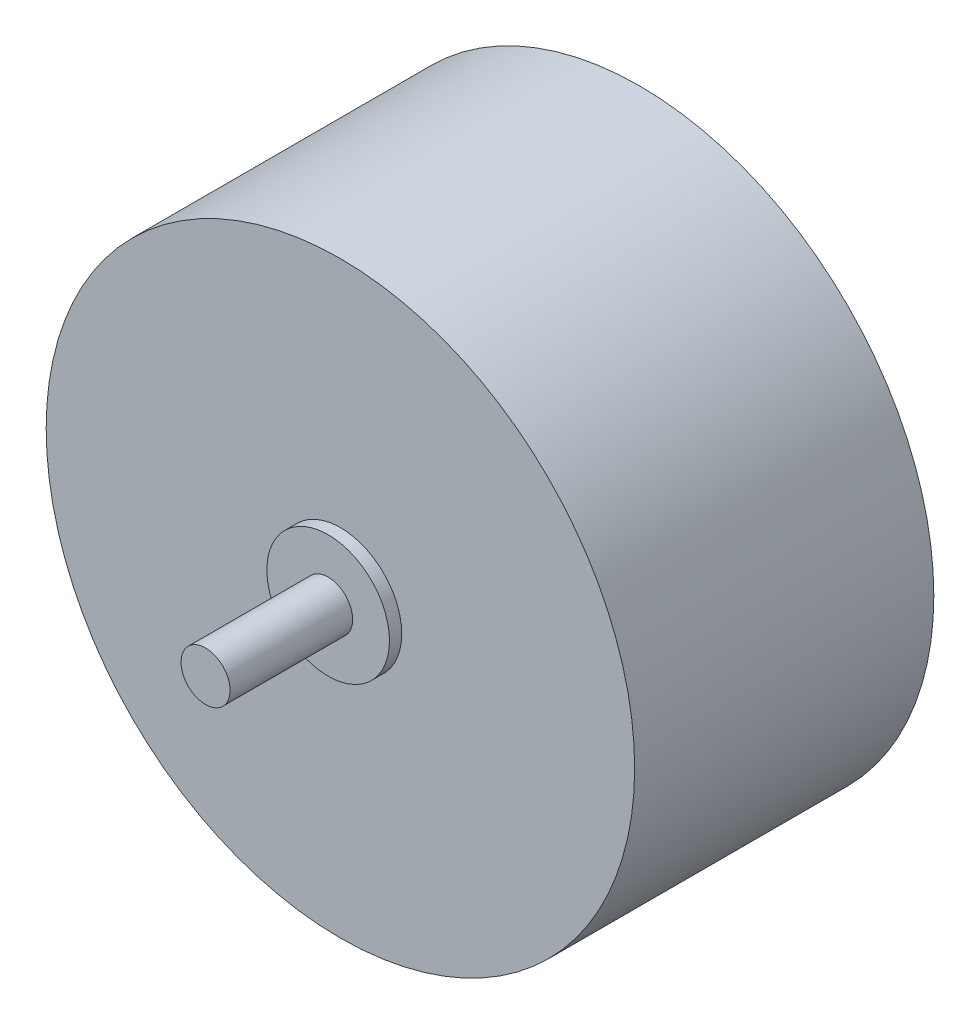
ISO-10303-21;
HEADER;
FILE_DESCRIPTION(('STEP AP214'),'2;1');
FILE_NAME('part.step','',(''),(''),'','','');
FILE_SCHEMA(('AUTOMOTIVE_DESIGN { 1 0 10303 214 1 1 1 1 }'));
ENDSEC;
DATA;
#1=APPLICATION_CONTEXT('core data for automotive mechanical design processes');
#2=APPLICATION_PROTOCOL_DEFINITION('international standard','automotive_design',2000,#1);
#3=PRODUCT_CONTEXT('',#1,'mechanical');
#4=PRODUCT('Part','Part','',(#3));
#5=PRODUCT_RELATED_PRODUCT_CATEGORY('part','',(#4));
#6=PRODUCT_DEFINITION_FORMATION('','',#4);
#7=PRODUCT_DEFINITION_CONTEXT('part definition',#1,'design');
#8=PRODUCT_DEFINITION('design','',#6,#7);
#9=PRODUCT_DEFINITION_SHAPE('','',#8);
#10=(LENGTH_UNIT() NAMED_UNIT(*) SI_UNIT(.MILLI.,.METRE.));
#11=(NAMED_UNIT(*) PLANE_ANGLE_UNIT() SI_UNIT($,.RADIAN.));
#12=(NAMED_UNIT(*) SI_UNIT($,.STERADIAN.) SOLID_ANGLE_UNIT());
#13=UNCERTAINTY_MEASURE_WITH_UNIT(LENGTH_MEASURE(1.E-05),#10,'distance_accuracy_value','');
#14=(GEOMETRIC_REPRESENTATION_CONTEXT(3) GLOBAL_UNCERTAINTY_ASSIGNED_CONTEXT((#13)) GLOBAL_UNIT_ASSIGNED_CONTEXT((#10,
#11,#12)) REPRESENTATION_CONTEXT('',''));
#15=CARTESIAN_POINT('',(0.,0.,0.));
#16=DIRECTION('',(0.,0.,1.));
#17=DIRECTION('',(1.,0.,0.));
#18=AXIS2_PLACEMENT_3D('',#15,#16,#17);
#19=CARTESIAN_POINT('',(0.,0.,12.2));
#20=DIRECTION('',(0.,0.,-1.));
#21=DIRECTION('',(-1.,0.,0.));
#22=AXIS2_PLACEMENT_3D('',#19,#20,#21);
#23=CYLINDRICAL_SURFACE('',#22,12.);
#24=CARTESIAN_POINT('',(0.,0.,12.2));
#25=DIRECTION('',(0.,0.,1.));
#26=DIRECTION('',(1.,0.,0.));
#27=AXIS2_PLACEMENT_3D('',#24,#25,#26);
#28=CIRCLE('',#27,12.);
#29=CARTESIAN_POINT('',(12.,0.,12.2));
#30=VERTEX_POINT('',#29);
#31=EDGE_CURVE('E62',#30,#30,#28,.T.);
#32=ORIENTED_EDGE('',*,*,#31,.F.);
#33=EDGE_LOOP('',(#32));
#34=FACE_BOUND('',#33,.T.);
#35=CARTESIAN_POINT('',(0.,0.,0.));
#36=DIRECTION('',(0.,0.,1.));
#37=DIRECTION('',(1.,0.,0.));
#38=AXIS2_PLACEMENT_3D('',#35,#36,#37);
#39=CIRCLE('',#38,12.);
#40=CARTESIAN_POINT('',(12.,0.,0.));
#41=VERTEX_POINT('',#40);
#42=EDGE_CURVE('E50',#41,#41,#39,.T.);
#43=ORIENTED_EDGE('',*,*,#42,.T.);
#44=EDGE_LOOP('',(#43));
#45=FACE_BOUND('',#44,.T.);
#46=ADVANCED_FACE('F47',(#34,#45),#23,.T.);
#47=CARTESIAN_POINT('',(0.,0.,12.2));
#48=DIRECTION('',(0.,0.,1.));
#49=DIRECTION('',(1.,0.,0.));
#50=AXIS2_PLACEMENT_3D('',#47,#48,#49);
#51=PLANE('',#50);
#52=CARTESIAN_POINT('',(0.,0.,12.2));
#53=DIRECTION('',(0.,0.,1.));
#54=DIRECTION('',(1.,0.,0.));
#55=AXIS2_PLACEMENT_3D('',#52,#53,#54);
#56=CIRCLE('',#55,2.5);
#57=CARTESIAN_POINT('',(2.5,0.,12.2));
#58=VERTEX_POINT('',#57);
#59=EDGE_CURVE('E55',#58,#58,#56,.T.);
#60=ORIENTED_EDGE('',*,*,#59,.F.);
#61=EDGE_LOOP('',(#60));
#62=FACE_BOUND('',#61,.T.);
#63=ORIENTED_EDGE('',*,*,#31,.T.);
#64=EDGE_LOOP('',(#63));
#65=FACE_BOUND('',#64,.T.);
#66=ADVANCED_FACE('F82',(#62,#65),#51,.T.);
#67=CARTESIAN_POINT('',(0.,0.,0.));
#68=DIRECTION('',(0.,0.,1.));
#69=DIRECTION('',(1.,0.,0.));
#70=AXIS2_PLACEMENT_3D('',#67,#68,#69);
#71=PLANE('',#70);
#72=ORIENTED_EDGE('',*,*,#42,.F.);
#73=EDGE_LOOP('',(#72));
#74=FACE_BOUND('',#73,.T.);
#75=ADVANCED_FACE('F79',(#74),#71,.F.);
#76=CARTESIAN_POINT('',(0.,0.,12.7));
#77=DIRECTION('',(0.,0.,-1.));
#78=DIRECTION('',(-1.,0.,0.));
#79=AXIS2_PLACEMENT_3D('',#76,#77,#78);
#80=CYLINDRICAL_SURFACE('',#79,2.5);
#81=CARTESIAN_POINT('',(0.,0.,12.7));
#82=DIRECTION('',(0.,0.,1.));
#83=DIRECTION('',(1.,0.,0.));
#84=AXIS2_PLACEMENT_3D('',#81,#82,#83);
#85=CIRCLE('',#84,2.5);
#86=CARTESIAN_POINT('',(2.5,0.,12.7));
#87=VERTEX_POINT('',#86);
#88=EDGE_CURVE('E67',#87,#87,#85,.T.);
#89=ORIENTED_EDGE('',*,*,#88,.F.);
#90=EDGE_LOOP('',(#89));
#91=FACE_BOUND('',#90,.T.);
#92=ORIENTED_EDGE('',*,*,#59,.T.);
#93=EDGE_LOOP('',(#92));
#94=FACE_BOUND('',#93,.T.);
#95=ADVANCED_FACE('F81',(#91,#94),#80,.T.);
#96=CARTESIAN_POINT('',(0.,0.,12.7));
#97=DIRECTION('',(0.,0.,1.));
#98=DIRECTION('',(1.,0.,0.));
#99=AXIS2_PLACEMENT_3D('',#96,#97,#98);
#100=PLANE('',#99);
#101=CARTESIAN_POINT('',(0.,0.,12.7));
#102=DIRECTION('',(0.,0.,1.));
#103=DIRECTION('',(1.,0.,0.));
#104=AXIS2_PLACEMENT_3D('',#101,#102,#103);
#105=CIRCLE('',#104,1.);
#106=CARTESIAN_POINT('',(1.,0.,12.7));
#107=VERTEX_POINT('',#106);
#108=EDGE_CURVE('E10',#107,#107,#105,.T.);
#109=ORIENTED_EDGE('',*,*,#108,.F.);
#110=EDGE_LOOP('',(#109));
#111=FACE_BOUND('',#110,.T.);
#112=ORIENTED_EDGE('',*,*,#88,.T.);
#113=EDGE_LOOP('',(#112));
#114=FACE_BOUND('',#113,.T.);
#115=ADVANCED_FACE('F86',(#111,#114),#100,.T.);
#116=CARTESIAN_POINT('',(0.,0.,17.7));
#117=DIRECTION('',(0.,0.,-1.));
#118=DIRECTION('',(-1.,0.,0.));
#119=AXIS2_PLACEMENT_3D('',#116,#117,#118);
#120=CYLINDRICAL_SURFACE('',#119,1.);
#121=CARTESIAN_POINT('',(0.,0.,17.7));
#122=DIRECTION('',(0.,0.,1.));
#123=DIRECTION('',(1.,0.,0.));
#124=AXIS2_PLACEMENT_3D('',#121,#122,#123);
#125=CIRCLE('',#124,1.);
#126=CARTESIAN_POINT('',(1.,0.,17.7));
#127=VERTEX_POINT('',#126);
#128=EDGE_CURVE('E66',#127,#127,#125,.T.);
#129=ORIENTED_EDGE('',*,*,#128,.F.);
#130=EDGE_LOOP('',(#129));
#131=FACE_BOUND('',#130,.T.);
#132=ORIENTED_EDGE('',*,*,#108,.T.);
#133=EDGE_LOOP('',(#132));
#134=FACE_BOUND('',#133,.T.);
#135=ADVANCED_FACE('F113',(#131,#134),#120,.T.);
#136=CARTESIAN_POINT('',(0.,0.,17.7));
#137=DIRECTION('',(0.,0.,1.));
#138=DIRECTION('',(1.,0.,0.));
#139=AXIS2_PLACEMENT_3D('',#136,#137,#138);
#140=PLANE('',#139);
#141=ORIENTED_EDGE('',*,*,#128,.T.);
#142=EDGE_LOOP('',(#141));
#143=FACE_BOUND('',#142,.T.);
#144=ADVANCED_FACE('F124',(#143),#140,.T.);
#145=CLOSED_SHELL('',(#46,#66,#75,#95,#115,#135,#144));
#146=MANIFOLD_SOLID_BREP('B2',#145);
#147=ADVANCED_BREP_SHAPE_REPRESENTATION('',(#18,#146),#14);
#148=SHAPE_DEFINITION_REPRESENTATION(#9,#147);
ENDSEC;
END-ISO-10303-21;
